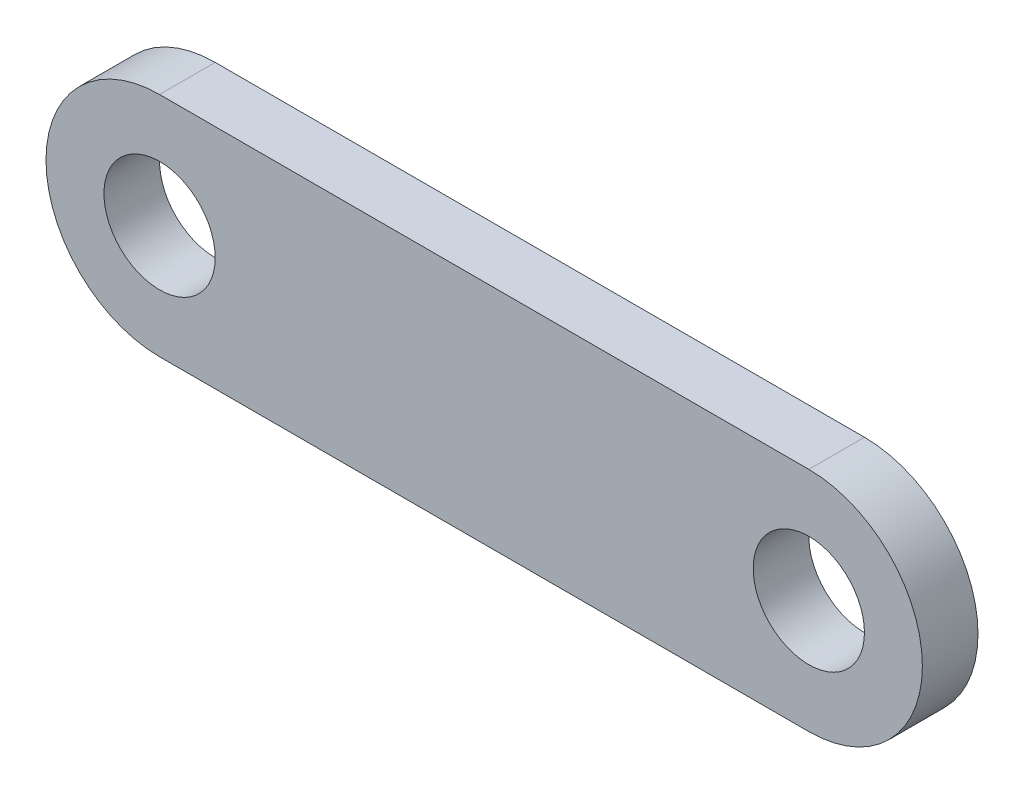
ISO-10303-21;
HEADER;
FILE_DESCRIPTION(('STEP AP214'),'2;1');
FILE_NAME('part.step','',(''),(''),'','','');
FILE_SCHEMA(('AUTOMOTIVE_DESIGN { 1 0 10303 214 1 1 1 1 }'));
ENDSEC;
DATA;
#1=APPLICATION_CONTEXT('core data for automotive mechanical design processes');
#2=APPLICATION_PROTOCOL_DEFINITION('international standard','automotive_design',2000,#1);
#3=PRODUCT_CONTEXT('',#1,'mechanical');
#4=PRODUCT('Part','Part','',(#3));
#5=PRODUCT_RELATED_PRODUCT_CATEGORY('part','',(#4));
#6=PRODUCT_DEFINITION_FORMATION('','',#4);
#7=PRODUCT_DEFINITION_CONTEXT('part definition',#1,'design');
#8=PRODUCT_DEFINITION('design','',#6,#7);
#9=PRODUCT_DEFINITION_SHAPE('','',#8);
#10=(LENGTH_UNIT() NAMED_UNIT(*) SI_UNIT(.MILLI.,.METRE.));
#11=(NAMED_UNIT(*) PLANE_ANGLE_UNIT() SI_UNIT($,.RADIAN.));
#12=(NAMED_UNIT(*) SI_UNIT($,.STERADIAN.) SOLID_ANGLE_UNIT());
#13=UNCERTAINTY_MEASURE_WITH_UNIT(LENGTH_MEASURE(1.E-05),#10,'distance_accuracy_value','');
#14=(GEOMETRIC_REPRESENTATION_CONTEXT(3) GLOBAL_UNCERTAINTY_ASSIGNED_CONTEXT((#13)) GLOBAL_UNIT_ASSIGNED_CONTEXT((#10,
#11,#12)) REPRESENTATION_CONTEXT('',''));
#15=CARTESIAN_POINT('',(0.,0.,0.));
#16=DIRECTION('',(0.,0.,1.));
#17=DIRECTION('',(1.,0.,0.));
#18=AXIS2_PLACEMENT_3D('',#15,#16,#17);
#19=CARTESIAN_POINT('',(5.835,0.,1.));
#20=DIRECTION('',(0.,0.,-1.));
#21=DIRECTION('',(-1.,0.,0.));
#22=AXIS2_PLACEMENT_3D('',#19,#20,#21);
#23=PLANE('',#22);
#24=CARTESIAN_POINT('',(5.835,0.,1.));
#25=DIRECTION('',(0.,0.,1.));
#26=DIRECTION('',(-1.,0.,0.));
#27=AXIS2_PLACEMENT_3D('',#24,#25,#26);
#28=CIRCLE('',#27,2.04131114382524);
#29=CARTESIAN_POINT('',(5.835,-2.04131114382524,1.));
#30=VERTEX_POINT('',#29);
#31=CARTESIAN_POINT('',(5.835,2.04131114382524,1.));
#32=VERTEX_POINT('',#31);
#33=EDGE_CURVE('E96',#30,#32,#28,.T.);
#34=ORIENTED_EDGE('',*,*,#33,.T.);
#35=DIRECTION('',(-1.,0.,0.));
#36=VECTOR('',#35,1.);
#37=CARTESIAN_POINT('',(-5.835,2.04131114382524,1.));
#38=LINE('',#37,#36);
#39=CARTESIAN_POINT('',(-5.835,2.04131114382524,1.));
#40=VERTEX_POINT('',#39);
#41=EDGE_CURVE('E91',#32,#40,#38,.T.);
#42=ORIENTED_EDGE('',*,*,#41,.T.);
#43=CARTESIAN_POINT('',(-5.835,0.,1.));
#44=DIRECTION('',(0.,0.,1.));
#45=DIRECTION('',(1.,0.,0.));
#46=AXIS2_PLACEMENT_3D('',#43,#44,#45);
#47=CIRCLE('',#46,2.04131114382524);
#48=CARTESIAN_POINT('',(-5.835,-2.04131114382524,1.));
#49=VERTEX_POINT('',#48);
#50=EDGE_CURVE('E94',#40,#49,#47,.T.);
#51=ORIENTED_EDGE('',*,*,#50,.T.);
#52=DIRECTION('',(1.,0.,0.));
#53=VECTOR('',#52,1.);
#54=CARTESIAN_POINT('',(-5.835,-2.04131114382524,1.));
#55=LINE('',#54,#53);
#56=EDGE_CURVE('E61',#49,#30,#55,.T.);
#57=ORIENTED_EDGE('',*,*,#56,.T.);
#58=EDGE_LOOP('',(#34,#42,#51,#57));
#59=FACE_BOUND('',#58,.T.);
#60=CARTESIAN_POINT('',(-5.835,0.,1.));
#61=DIRECTION('',(0.,0.,1.));
#62=DIRECTION('',(1.,0.,0.));
#63=AXIS2_PLACEMENT_3D('',#60,#61,#62);
#64=CIRCLE('',#63,1.);
#65=CARTESIAN_POINT('',(-4.835,0.,1.));
#66=VERTEX_POINT('',#65);
#67=EDGE_CURVE('E116',#66,#66,#64,.T.);
#68=ORIENTED_EDGE('',*,*,#67,.F.);
#69=EDGE_LOOP('',(#68));
#70=FACE_BOUND('',#69,.T.);
#71=CARTESIAN_POINT('',(5.835,0.,1.));
#72=DIRECTION('',(0.,0.,1.));
#73=DIRECTION('',(1.,0.,0.));
#74=AXIS2_PLACEMENT_3D('',#71,#72,#73);
#75=CIRCLE('',#74,1.);
#76=CARTESIAN_POINT('',(6.835,0.,1.));
#77=VERTEX_POINT('',#76);
#78=EDGE_CURVE('E138',#77,#77,#75,.T.);
#79=ORIENTED_EDGE('',*,*,#78,.F.);
#80=EDGE_LOOP('',(#79));
#81=FACE_BOUND('',#80,.T.);
#82=ADVANCED_FACE('F43',(#59,#70,#81),#23,.F.);
#83=CARTESIAN_POINT('',(5.835,0.,0.));
#84=DIRECTION('',(0.,0.,-1.));
#85=DIRECTION('',(-1.,0.,0.));
#86=AXIS2_PLACEMENT_3D('',#83,#84,#85);
#87=PLANE('',#86);
#88=CARTESIAN_POINT('',(-5.835,0.,0.));
#89=DIRECTION('',(0.,0.,1.));
#90=DIRECTION('',(1.,0.,0.));
#91=AXIS2_PLACEMENT_3D('',#88,#89,#90);
#92=CIRCLE('',#91,1.);
#93=CARTESIAN_POINT('',(-4.835,0.,0.));
#94=VERTEX_POINT('',#93);
#95=EDGE_CURVE('E134',#94,#94,#92,.T.);
#96=ORIENTED_EDGE('',*,*,#95,.T.);
#97=EDGE_LOOP('',(#96));
#98=FACE_BOUND('',#97,.T.);
#99=CARTESIAN_POINT('',(5.835,0.,0.));
#100=DIRECTION('',(0.,0.,1.));
#101=DIRECTION('',(-1.,0.,0.));
#102=AXIS2_PLACEMENT_3D('',#99,#100,#101);
#103=CIRCLE('',#102,2.04131114382524);
#104=CARTESIAN_POINT('',(5.835,-2.04131114382524,0.));
#105=VERTEX_POINT('',#104);
#106=CARTESIAN_POINT('',(5.835,2.04131114382524,0.));
#107=VERTEX_POINT('',#106);
#108=EDGE_CURVE('E112',#105,#107,#103,.T.);
#109=ORIENTED_EDGE('',*,*,#108,.F.);
#110=DIRECTION('',(1.,0.,0.));
#111=VECTOR('',#110,1.);
#112=CARTESIAN_POINT('',(-5.835,-2.04131114382524,0.));
#113=LINE('',#112,#111);
#114=CARTESIAN_POINT('',(-5.835,-2.04131114382524,0.));
#115=VERTEX_POINT('',#114);
#116=EDGE_CURVE('E84',#115,#105,#113,.T.);
#117=ORIENTED_EDGE('',*,*,#116,.F.);
#118=CARTESIAN_POINT('',(-5.835,0.,0.));
#119=DIRECTION('',(0.,0.,1.));
#120=DIRECTION('',(1.,0.,0.));
#121=AXIS2_PLACEMENT_3D('',#118,#119,#120);
#122=CIRCLE('',#121,2.04131114382524);
#123=CARTESIAN_POINT('',(-5.835,2.04131114382524,0.));
#124=VERTEX_POINT('',#123);
#125=EDGE_CURVE('E78',#124,#115,#122,.T.);
#126=ORIENTED_EDGE('',*,*,#125,.F.);
#127=DIRECTION('',(-1.,0.,0.));
#128=VECTOR('',#127,1.);
#129=CARTESIAN_POINT('',(-5.835,2.04131114382524,0.));
#130=LINE('',#129,#128);
#131=EDGE_CURVE('E101',#107,#124,#130,.T.);
#132=ORIENTED_EDGE('',*,*,#131,.F.);
#133=EDGE_LOOP('',(#109,#117,#126,#132));
#134=FACE_BOUND('',#133,.T.);
#135=CARTESIAN_POINT('',(5.835,0.,0.));
#136=DIRECTION('',(0.,0.,1.));
#137=DIRECTION('',(1.,0.,0.));
#138=AXIS2_PLACEMENT_3D('',#135,#136,#137);
#139=CIRCLE('',#138,1.);
#140=CARTESIAN_POINT('',(6.835,0.,0.));
#141=VERTEX_POINT('',#140);
#142=EDGE_CURVE('E142',#141,#141,#139,.T.);
#143=ORIENTED_EDGE('',*,*,#142,.T.);
#144=EDGE_LOOP('',(#143));
#145=FACE_BOUND('',#144,.T.);
#146=ADVANCED_FACE('F129',(#98,#134,#145),#87,.T.);
#147=CARTESIAN_POINT('',(5.835,0.,1.));
#148=DIRECTION('',(0.,0.,-1.));
#149=DIRECTION('',(-1.,0.,0.));
#150=AXIS2_PLACEMENT_3D('',#147,#148,#149);
#151=CYLINDRICAL_SURFACE('',#150,2.04131114382524);
#152=ORIENTED_EDGE('',*,*,#108,.T.);
#153=DIRECTION('',(0.,0.,-1.));
#154=VECTOR('',#153,1.);
#155=CARTESIAN_POINT('',(5.835,2.04131114382524,1.));
#156=LINE('',#155,#154);
#157=EDGE_CURVE('E11',#32,#107,#156,.T.);
#158=ORIENTED_EDGE('',*,*,#157,.F.);
#159=ORIENTED_EDGE('',*,*,#33,.F.);
#160=DIRECTION('',(0.,0.,-1.));
#161=VECTOR('',#160,1.);
#162=CARTESIAN_POINT('',(5.835,-2.04131114382524,1.));
#163=LINE('',#162,#161);
#164=EDGE_CURVE('E108',#30,#105,#163,.T.);
#165=ORIENTED_EDGE('',*,*,#164,.T.);
#166=EDGE_LOOP('',(#152,#158,#159,#165));
#167=FACE_BOUND('',#166,.T.);
#168=ADVANCED_FACE('F45',(#167),#151,.T.);
#169=CARTESIAN_POINT('',(-5.835,2.04131114382524,1.));
#170=DIRECTION('',(0.,-1.,0.));
#171=DIRECTION('',(0.,0.,-1.));
#172=AXIS2_PLACEMENT_3D('',#169,#170,#171);
#173=PLANE('',#172);
#174=ORIENTED_EDGE('',*,*,#131,.T.);
#175=DIRECTION('',(0.,0.,-1.));
#176=VECTOR('',#175,1.);
#177=CARTESIAN_POINT('',(-5.835,2.04131114382524,1.));
#178=LINE('',#177,#176);
#179=EDGE_CURVE('E53',#40,#124,#178,.T.);
#180=ORIENTED_EDGE('',*,*,#179,.F.);
#181=ORIENTED_EDGE('',*,*,#41,.F.);
#182=ORIENTED_EDGE('',*,*,#157,.T.);
#183=EDGE_LOOP('',(#174,#180,#181,#182));
#184=FACE_BOUND('',#183,.T.);
#185=ADVANCED_FACE('F100',(#184),#173,.F.);
#186=CARTESIAN_POINT('',(-5.835,0.,1.));
#187=DIRECTION('',(0.,0.,-1.));
#188=DIRECTION('',(-1.,0.,0.));
#189=AXIS2_PLACEMENT_3D('',#186,#187,#188);
#190=CYLINDRICAL_SURFACE('',#189,2.04131114382524);
#191=ORIENTED_EDGE('',*,*,#125,.T.);
#192=DIRECTION('',(0.,0.,-1.));
#193=VECTOR('',#192,1.);
#194=CARTESIAN_POINT('',(-5.835,-2.04131114382524,1.));
#195=LINE('',#194,#193);
#196=EDGE_CURVE('E103',#49,#115,#195,.T.);
#197=ORIENTED_EDGE('',*,*,#196,.F.);
#198=ORIENTED_EDGE('',*,*,#50,.F.);
#199=ORIENTED_EDGE('',*,*,#179,.T.);
#200=EDGE_LOOP('',(#191,#197,#198,#199));
#201=FACE_BOUND('',#200,.T.);
#202=ADVANCED_FACE('F104',(#201),#190,.T.);
#203=CARTESIAN_POINT('',(-5.835,-2.04131114382524,1.));
#204=DIRECTION('',(0.,1.,0.));
#205=DIRECTION('',(0.,0.,1.));
#206=AXIS2_PLACEMENT_3D('',#203,#204,#205);
#207=PLANE('',#206);
#208=ORIENTED_EDGE('',*,*,#116,.T.);
#209=ORIENTED_EDGE('',*,*,#164,.F.);
#210=ORIENTED_EDGE('',*,*,#56,.F.);
#211=ORIENTED_EDGE('',*,*,#196,.T.);
#212=EDGE_LOOP('',(#208,#209,#210,#211));
#213=FACE_BOUND('',#212,.T.);
#214=ADVANCED_FACE('F126',(#213),#207,.F.);
#215=CARTESIAN_POINT('',(-5.835,0.,1.));
#216=DIRECTION('',(0.,0.,-1.));
#217=DIRECTION('',(-1.,0.,0.));
#218=AXIS2_PLACEMENT_3D('',#215,#216,#217);
#219=CYLINDRICAL_SURFACE('',#218,1.);
#220=ORIENTED_EDGE('',*,*,#67,.T.);
#221=EDGE_LOOP('',(#220));
#222=FACE_BOUND('',#221,.T.);
#223=ORIENTED_EDGE('',*,*,#95,.F.);
#224=EDGE_LOOP('',(#223));
#225=FACE_BOUND('',#224,.T.);
#226=ADVANCED_FACE('F161',(#222,#225),#219,.F.);
#227=CARTESIAN_POINT('',(5.835,0.,1.));
#228=DIRECTION('',(0.,0.,-1.));
#229=DIRECTION('',(-1.,0.,0.));
#230=AXIS2_PLACEMENT_3D('',#227,#228,#229);
#231=CYLINDRICAL_SURFACE('',#230,1.);
#232=ORIENTED_EDGE('',*,*,#78,.T.);
#233=EDGE_LOOP('',(#232));
#234=FACE_BOUND('',#233,.T.);
#235=ORIENTED_EDGE('',*,*,#142,.F.);
#236=EDGE_LOOP('',(#235));
#237=FACE_BOUND('',#236,.T.);
#238=ADVANCED_FACE('F150',(#234,#237),#231,.F.);
#239=CLOSED_SHELL('',(#82,#146,#168,#185,#202,#214,#226,#238));
#240=MANIFOLD_SOLID_BREP('B2',#239);
#241=ADVANCED_BREP_SHAPE_REPRESENTATION('',(#18,#240),#14);
#242=SHAPE_DEFINITION_REPRESENTATION(#9,#241);
ENDSEC;
END-ISO-10303-21;
